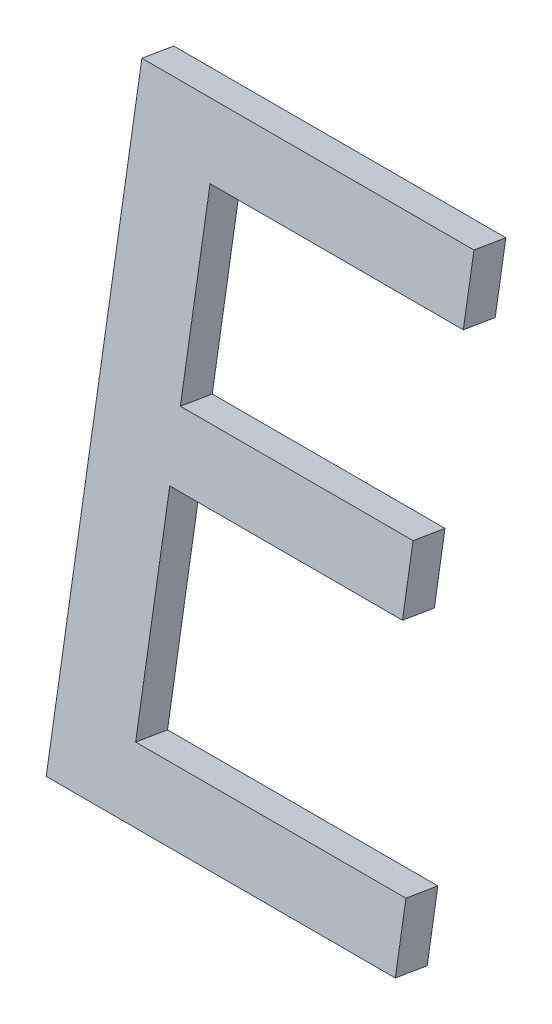
ISO-10303-21;
HEADER;
FILE_DESCRIPTION(('STEP AP214'),'2;1');
FILE_NAME('part.step','',(''),(''),'','','');
FILE_SCHEMA(('AUTOMOTIVE_DESIGN { 1 0 10303 214 1 1 1 1 }'));
ENDSEC;
DATA;
#1=APPLICATION_CONTEXT('core data for automotive mechanical design processes');
#2=APPLICATION_PROTOCOL_DEFINITION('international standard','automotive_design',2000,#1);
#3=PRODUCT_CONTEXT('',#1,'mechanical');
#4=PRODUCT('Part','Part','',(#3));
#5=PRODUCT_RELATED_PRODUCT_CATEGORY('part','',(#4));
#6=PRODUCT_DEFINITION_FORMATION('','',#4);
#7=PRODUCT_DEFINITION_CONTEXT('part definition',#1,'design');
#8=PRODUCT_DEFINITION('design','',#6,#7);
#9=PRODUCT_DEFINITION_SHAPE('','',#8);
#10=(LENGTH_UNIT() NAMED_UNIT(*) SI_UNIT(.MILLI.,.METRE.));
#11=(NAMED_UNIT(*) PLANE_ANGLE_UNIT() SI_UNIT($,.RADIAN.));
#12=(NAMED_UNIT(*) SI_UNIT($,.STERADIAN.) SOLID_ANGLE_UNIT());
#13=UNCERTAINTY_MEASURE_WITH_UNIT(LENGTH_MEASURE(1.E-05),#10,'distance_accuracy_value','');
#14=(GEOMETRIC_REPRESENTATION_CONTEXT(3) GLOBAL_UNCERTAINTY_ASSIGNED_CONTEXT((#13)) GLOBAL_UNIT_ASSIGNED_CONTEXT((#10,
#11,#12)) REPRESENTATION_CONTEXT('',''));
#15=CARTESIAN_POINT('',(0.,0.,0.));
#16=DIRECTION('',(0.,0.,1.));
#17=DIRECTION('',(1.,0.,0.));
#18=AXIS2_PLACEMENT_3D('',#15,#16,#17);
#19=CARTESIAN_POINT('',(1436.6184962406,1188.45228553672,1236.29933367569));
#20=DIRECTION('',(-1.,0.,0.));
#21=DIRECTION('',(0.,-1.,0.));
#22=AXIS2_PLACEMENT_3D('',#19,#20,#21);
#23=PLANE('',#22);
#24=CARTESIAN_POINT('',(1436.6184962406,1187.63029060019,1231.36736405653));
#25=CARTESIAN_POINT('',(1436.6184962406,1217.22210831516,1226.43539443737));
#26=CARTESIAN_POINT('',(1436.6184962406,1246.81392603012,1221.50342481821));
#27=CARTESIAN_POINT('',(1436.6184962406,1276.40574374509,1216.57145519905));
#28=B_SPLINE_CURVE_WITH_KNOTS('',3,(#24,#25,#26,#27),.UNSPECIFIED.,.F.,.F.,(4,4),(0.,
0.205346629227362),.UNSPECIFIED.);
#29=CARTESIAN_POINT('',(1436.6184962406,1187.63029060019,1231.36736405653));
#30=VERTEX_POINT('',#29);
#31=CARTESIAN_POINT('',(1436.6184962406,1276.40574374509,1216.57145519905));
#32=VERTEX_POINT('',#31);
#33=EDGE_CURVE('E117',#30,#32,#28,.T.);
#34=ORIENTED_EDGE('',*,*,#33,.F.);
#35=DIRECTION('',(0.,-0.164398987305355,-0.986393923832144));
#36=VECTOR('',#35,1.);
#37=CARTESIAN_POINT('',(1436.6184962406,1188.45228553672,1236.29933367569));
#38=LINE('',#37,#36);
#39=CARTESIAN_POINT('',(1436.6184962406,1188.45228553672,1236.29933367569));
#40=VERTEX_POINT('',#39);
#41=EDGE_CURVE('E108',#40,#30,#38,.T.);
#42=ORIENTED_EDGE('',*,*,#41,.F.);
#43=CARTESIAN_POINT('',(1436.6184962406,1188.45228553672,1236.29933367569));
#44=CARTESIAN_POINT('',(1436.6184962406,1218.04410325169,1231.36736405653));
#45=CARTESIAN_POINT('',(1436.6184962406,1247.63592096665,1226.43539443737));
#46=CARTESIAN_POINT('',(1436.6184962406,1277.22773868161,1221.50342481821));
#47=B_SPLINE_CURVE_WITH_KNOTS('',3,(#43,#44,#45,#46),.UNSPECIFIED.,.F.,.F.,(4,4),(0.,
0.205346629227362),.UNSPECIFIED.);
#48=CARTESIAN_POINT('',(1436.6184962406,1277.22773868161,1221.50342481821));
#49=VERTEX_POINT('',#48);
#50=EDGE_CURVE('E116',#40,#49,#47,.T.);
#51=ORIENTED_EDGE('',*,*,#50,.T.);
#52=DIRECTION('',(0.,-0.164398987305355,-0.986393923832144));
#53=VECTOR('',#52,1.);
#54=CARTESIAN_POINT('',(1436.6184962406,1277.22773868161,1221.50342481821));
#55=LINE('',#54,#53);
#56=EDGE_CURVE('E126',#49,#32,#55,.T.);
#57=ORIENTED_EDGE('',*,*,#56,.T.);
#58=EDGE_LOOP('',(#34,#42,#51,#57));
#59=FACE_BOUND('',#58,.T.);
#60=ADVANCED_FACE('F17',(#59),#23,.T.);
#61=CARTESIAN_POINT('',(1436.6184962406,1277.22773868161,1221.50342481821));
#62=DIRECTION('',(0.,0.986393923832144,-0.164398987305355));
#63=DIRECTION('',(0.,0.164398987305355,0.986393923832144));
#64=AXIS2_PLACEMENT_3D('',#61,#62,#63);
#65=PLANE('',#64);
#66=CARTESIAN_POINT('',(1436.6184962406,1276.40574374509,1216.57145519905));
#67=CARTESIAN_POINT('',(1453.7354887218,1276.40574374509,1216.57145519905));
#68=CARTESIAN_POINT('',(1470.852481203,1276.40574374509,1216.57145519905));
#69=CARTESIAN_POINT('',(1487.96947368421,1276.40574374509,1216.57145519905));
#70=B_SPLINE_CURVE_WITH_KNOTS('',3,(#66,#67,#68,#69),.UNSPECIFIED.,.F.,.F.,(4,4),
(0.205346629227362,0.322510519511532),.UNSPECIFIED.);
#71=CARTESIAN_POINT('',(1487.96947368421,1276.40574374509,1216.57145519905));
#72=VERTEX_POINT('',#71);
#73=EDGE_CURVE('E144',#32,#72,#70,.T.);
#74=ORIENTED_EDGE('',*,*,#73,.F.);
#75=ORIENTED_EDGE('',*,*,#56,.F.);
#76=CARTESIAN_POINT('',(1436.6184962406,1277.22773868161,1221.50342481821));
#77=CARTESIAN_POINT('',(1453.7354887218,1277.22773868161,1221.50342481821));
#78=CARTESIAN_POINT('',(1470.852481203,1277.22773868161,1221.50342481821));
#79=CARTESIAN_POINT('',(1487.96947368421,1277.22773868161,1221.50342481821));
#80=B_SPLINE_CURVE_WITH_KNOTS('',3,(#76,#77,#78,#79),.UNSPECIFIED.,.F.,.F.,(4,4),
(0.205346629227362,0.322510519511532),.UNSPECIFIED.);
#81=CARTESIAN_POINT('',(1487.96947368421,1277.22773868161,1221.50342481821));
#82=VERTEX_POINT('',#81);
#83=EDGE_CURVE('E154',#49,#82,#80,.T.);
#84=ORIENTED_EDGE('',*,*,#83,.T.);
#85=DIRECTION('',(0.,-0.164398987305355,-0.986393923832144));
#86=VECTOR('',#85,1.);
#87=CARTESIAN_POINT('',(1487.96947368421,1277.22773868161,1221.50342481821));
#88=LINE('',#87,#86);
#89=EDGE_CURVE('E165',#82,#72,#88,.T.);
#90=ORIENTED_EDGE('',*,*,#89,.T.);
#91=EDGE_LOOP('',(#74,#75,#84,#90));
#92=FACE_BOUND('',#91,.T.);
#93=ADVANCED_FACE('F536',(#92),#65,.T.);
#94=CARTESIAN_POINT('',(1487.96947368421,1277.22773868161,1221.50342481821));
#95=DIRECTION('',(1.,0.,0.));
#96=DIRECTION('',(0.,0.,-1.));
#97=AXIS2_PLACEMENT_3D('',#94,#95,#96);
#98=PLANE('',#97);
#99=CARTESIAN_POINT('',(1487.96947368421,1276.40574374509,1216.57145519905));
#100=CARTESIAN_POINT('',(1487.96947368421,1273.11632221878,1217.1196921201));
#101=CARTESIAN_POINT('',(1487.96947368421,1269.82690069247,1217.66792904115));
#102=CARTESIAN_POINT('',(1487.96947368421,1266.53747916617,1218.2161659622));
#103=B_SPLINE_CURVE_WITH_KNOTS('',3,(#99,#100,#101,#102),.UNSPECIFIED.,.F.,.F.,(4,4),
(0.322510519511532,0.345336816599512),.UNSPECIFIED.);
#104=CARTESIAN_POINT('',(1487.96947368421,1266.53747916617,1218.2161659622));
#105=VERTEX_POINT('',#104);
#106=EDGE_CURVE('E168',#72,#105,#103,.T.);
#107=ORIENTED_EDGE('',*,*,#106,.F.);
#108=ORIENTED_EDGE('',*,*,#89,.F.);
#109=CARTESIAN_POINT('',(1487.96947368421,1277.22773868161,1221.50342481821));
#110=CARTESIAN_POINT('',(1487.96947368421,1273.93831715531,1222.05166173926));
#111=CARTESIAN_POINT('',(1487.96947368421,1270.648895629,1222.59989866031));
#112=CARTESIAN_POINT('',(1487.96947368421,1267.35947410269,1223.14813558136));
#113=B_SPLINE_CURVE_WITH_KNOTS('',3,(#109,#110,#111,#112),.UNSPECIFIED.,.F.,.F.,(4,4),
(0.322510519511532,0.345336816599512),.UNSPECIFIED.);
#114=CARTESIAN_POINT('',(1487.96947368421,1267.35947410269,1223.14813558136));
#115=VERTEX_POINT('',#114);
#116=EDGE_CURVE('E179',#82,#115,#113,.T.);
#117=ORIENTED_EDGE('',*,*,#116,.T.);
#118=DIRECTION('',(0.,-0.164398987305355,-0.986393923832144));
#119=VECTOR('',#118,1.);
#120=CARTESIAN_POINT('',(1487.96947368421,1267.35947410269,1223.14813558136));
#121=LINE('',#120,#119);
#122=EDGE_CURVE('E190',#115,#105,#121,.T.);
#123=ORIENTED_EDGE('',*,*,#122,.T.);
#124=EDGE_LOOP('',(#107,#108,#117,#123));
#125=FACE_BOUND('',#124,.T.);
#126=ADVANCED_FACE('F525',(#125),#98,.T.);
#127=CARTESIAN_POINT('',(1487.96947368421,1267.35947410269,1223.14813558136));
#128=DIRECTION('',(0.,-0.986393923832144,0.164398987305355));
#129=DIRECTION('',(0.,-0.164398987305355,-0.986393923832144));
#130=AXIS2_PLACEMENT_3D('',#127,#128,#129);
#131=PLANE('',#130);
#132=CARTESIAN_POINT('',(1487.96947368421,1266.53747916617,1218.2161659622));
#133=CARTESIAN_POINT('',(1474.91503759398,1266.53747916617,1218.2161659622));
#134=CARTESIAN_POINT('',(1461.86060150376,1266.53747916617,1218.2161659622));
#135=CARTESIAN_POINT('',(1448.80616541353,1266.53747916617,1218.2161659622));
#136=B_SPLINE_CURVE_WITH_KNOTS('',3,(#132,#133,#134,#135),.UNSPECIFIED.,.F.,.F.,(4,4),
(0.345336816599512,0.434692964852573),.UNSPECIFIED.);
#137=CARTESIAN_POINT('',(1448.80616541353,1266.53747916617,1218.2161659622));
#138=VERTEX_POINT('',#137);
#139=EDGE_CURVE('E193',#105,#138,#136,.T.);
#140=ORIENTED_EDGE('',*,*,#139,.F.);
#141=ORIENTED_EDGE('',*,*,#122,.F.);
#142=CARTESIAN_POINT('',(1487.96947368421,1267.35947410269,1223.14813558136));
#143=CARTESIAN_POINT('',(1474.91503759398,1267.35947410269,1223.14813558136));
#144=CARTESIAN_POINT('',(1461.86060150376,1267.35947410269,1223.14813558136));
#145=CARTESIAN_POINT('',(1448.80616541353,1267.35947410269,1223.14813558136));
#146=B_SPLINE_CURVE_WITH_KNOTS('',3,(#142,#143,#144,#145),.UNSPECIFIED.,.F.,.F.,(4,4),
(0.345336816599512,0.434692964852573),.UNSPECIFIED.);
#147=CARTESIAN_POINT('',(1448.80616541353,1267.35947410269,1223.14813558136));
#148=VERTEX_POINT('',#147);
#149=EDGE_CURVE('E204',#115,#148,#146,.T.);
#150=ORIENTED_EDGE('',*,*,#149,.T.);
#151=DIRECTION('',(0.,-0.164398987305355,-0.986393923832144));
#152=VECTOR('',#151,1.);
#153=CARTESIAN_POINT('',(1448.80616541353,1267.35947410269,1223.14813558136));
#154=LINE('',#153,#152);
#155=EDGE_CURVE('E215',#148,#138,#154,.T.);
#156=ORIENTED_EDGE('',*,*,#155,.T.);
#157=EDGE_LOOP('',(#140,#141,#150,#156));
#158=FACE_BOUND('',#157,.T.);
#159=ADVANCED_FACE('F514',(#158),#131,.T.);
#160=CARTESIAN_POINT('',(1448.80616541353,1267.35947410269,1223.14813558136));
#161=DIRECTION('',(1.,0.,0.));
#162=DIRECTION('',(0.,0.,-1.));
#163=AXIS2_PLACEMENT_3D('',#160,#161,#162);
#164=PLANE('',#163);
#165=CARTESIAN_POINT('',(1448.80616541353,1266.53747916617,1218.2161659622));
#166=CARTESIAN_POINT('',(1448.80616541353,1257.36343175355,1219.74517386431));
#167=CARTESIAN_POINT('',(1448.80616541353,1248.18938434093,1221.27418176641));
#168=CARTESIAN_POINT('',(1448.80616541353,1239.01533692831,1222.80318966851));
#169=B_SPLINE_CURVE_WITH_KNOTS('',3,(#165,#166,#167,#168),.UNSPECIFIED.,.F.,.F.,(4,4),
(0.434692964852573,0.498354471918455),.UNSPECIFIED.);
#170=CARTESIAN_POINT('',(1448.80616541353,1239.01533692831,1222.80318966851));
#171=VERTEX_POINT('',#170);
#172=EDGE_CURVE('E218',#138,#171,#169,.T.);
#173=ORIENTED_EDGE('',*,*,#172,.F.);
#174=ORIENTED_EDGE('',*,*,#155,.F.);
#175=CARTESIAN_POINT('',(1448.80616541353,1267.35947410269,1223.14813558136));
#176=CARTESIAN_POINT('',(1448.80616541353,1258.18542669007,1224.67714348347));
#177=CARTESIAN_POINT('',(1448.80616541353,1249.01137927745,1226.20615138557));
#178=CARTESIAN_POINT('',(1448.80616541353,1239.83733186483,1227.73515928767));
#179=B_SPLINE_CURVE_WITH_KNOTS('',3,(#175,#176,#177,#178),.UNSPECIFIED.,.F.,.F.,(4,4),
(0.434692964852573,0.498354471918455),.UNSPECIFIED.);
#180=CARTESIAN_POINT('',(1448.80616541353,1239.83733186483,1227.73515928767));
#181=VERTEX_POINT('',#180);
#182=EDGE_CURVE('E229',#148,#181,#179,.T.);
#183=ORIENTED_EDGE('',*,*,#182,.T.);
#184=DIRECTION('',(0.,-0.164398987305355,-0.986393923832144));
#185=VECTOR('',#184,1.);
#186=CARTESIAN_POINT('',(1448.80616541353,1239.83733186483,1227.73515928767));
#187=LINE('',#186,#185);
#188=EDGE_CURVE('E240',#181,#171,#187,.T.);
#189=ORIENTED_EDGE('',*,*,#188,.T.);
#190=EDGE_LOOP('',(#173,#174,#183,#189));
#191=FACE_BOUND('',#190,.T.);
#192=ADVANCED_FACE('F503',(#191),#164,.T.);
#193=CARTESIAN_POINT('',(1448.80616541353,1239.83733186483,1227.73515928767));
#194=DIRECTION('',(0.,0.986393923832144,-0.164398987305355));
#195=DIRECTION('',(0.,0.164398987305355,0.986393923832144));
#196=AXIS2_PLACEMENT_3D('',#193,#194,#195);
#197=PLANE('',#196);
#198=CARTESIAN_POINT('',(1448.80616541353,1239.01533692831,1222.80318966851));
#199=CARTESIAN_POINT('',(1460.80195488722,1239.01533692831,1222.80318966851));
#200=CARTESIAN_POINT('',(1472.7977443609,1239.01533692831,1222.80318966851));
#201=CARTESIAN_POINT('',(1484.79353383458,1239.01533692831,1222.80318966851));
#202=B_SPLINE_CURVE_WITH_KNOTS('',3,(#198,#199,#200,#201),.UNSPECIFIED.,.F.,.F.,(4,4),
(0.498354471918455,0.580464303029859),.UNSPECIFIED.);
#203=CARTESIAN_POINT('',(1484.79353383458,1239.01533692831,1222.80318966851));
#204=VERTEX_POINT('',#203);
#205=EDGE_CURVE('E243',#171,#204,#202,.T.);
#206=ORIENTED_EDGE('',*,*,#205,.F.);
#207=ORIENTED_EDGE('',*,*,#188,.F.);
#208=CARTESIAN_POINT('',(1448.80616541353,1239.83733186483,1227.73515928767));
#209=CARTESIAN_POINT('',(1460.80195488722,1239.83733186483,1227.73515928767));
#210=CARTESIAN_POINT('',(1472.7977443609,1239.83733186483,1227.73515928767));
#211=CARTESIAN_POINT('',(1484.79353383458,1239.83733186483,1227.73515928767));
#212=B_SPLINE_CURVE_WITH_KNOTS('',3,(#208,#209,#210,#211),.UNSPECIFIED.,.F.,.F.,(4,4),
(0.498354471918455,0.580464303029859),.UNSPECIFIED.);
#213=CARTESIAN_POINT('',(1484.79353383458,1239.83733186483,1227.73515928767));
#214=VERTEX_POINT('',#213);
#215=EDGE_CURVE('E254',#181,#214,#212,.T.);
#216=ORIENTED_EDGE('',*,*,#215,.T.);
#217=DIRECTION('',(0.,-0.164398987305355,-0.986393923832144));
#218=VECTOR('',#217,1.);
#219=CARTESIAN_POINT('',(1484.79353383458,1239.83733186483,1227.73515928767));
#220=LINE('',#219,#218);
#221=EDGE_CURVE('E265',#214,#204,#220,.T.);
#222=ORIENTED_EDGE('',*,*,#221,.T.);
#223=EDGE_LOOP('',(#206,#207,#216,#222));
#224=FACE_BOUND('',#223,.T.);
#225=ADVANCED_FACE('F492',(#224),#197,.T.);
#226=CARTESIAN_POINT('',(1484.79353383458,1239.83733186483,1227.73515928767));
#227=DIRECTION('',(1.,0.,0.));
#228=DIRECTION('',(0.,0.,-1.));
#229=AXIS2_PLACEMENT_3D('',#226,#227,#228);
#230=PLANE('',#229);
#231=CARTESIAN_POINT('',(1484.79353383458,1239.01533692831,1222.80318966851));
#232=CARTESIAN_POINT('',(1484.79353383458,1235.7324034129,1223.35034525441));
#233=CARTESIAN_POINT('',(1484.79353383458,1232.44946989749,1223.89750084032));
#234=CARTESIAN_POINT('',(1484.79353383458,1229.16653638208,1224.44465642622));
#235=B_SPLINE_CURVE_WITH_KNOTS('',3,(#231,#232,#233,#234),.UNSPECIFIED.,.F.,.F.,(4,4),
(0.580464303029859,0.603245577835614),.UNSPECIFIED.);
#236=CARTESIAN_POINT('',(1484.79353383458,1229.16653638208,1224.44465642622));
#237=VERTEX_POINT('',#236);
#238=EDGE_CURVE('E268',#204,#237,#235,.T.);
#239=ORIENTED_EDGE('',*,*,#238,.F.);
#240=ORIENTED_EDGE('',*,*,#221,.F.);
#241=CARTESIAN_POINT('',(1484.79353383458,1239.83733186483,1227.73515928767));
#242=CARTESIAN_POINT('',(1484.79353383458,1236.55439834943,1228.28231487358));
#243=CARTESIAN_POINT('',(1484.79353383458,1233.27146483402,1228.82947045948));
#244=CARTESIAN_POINT('',(1484.79353383458,1229.98853131861,1229.37662604538));
#245=B_SPLINE_CURVE_WITH_KNOTS('',3,(#241,#242,#243,#244),.UNSPECIFIED.,.F.,.F.,(4,4),
(0.580464303029859,0.603245577835614),.UNSPECIFIED.);
#246=CARTESIAN_POINT('',(1484.79353383458,1229.98853131861,1229.37662604538));
#247=VERTEX_POINT('',#246);
#248=EDGE_CURVE('E279',#214,#247,#245,.T.);
#249=ORIENTED_EDGE('',*,*,#248,.T.);
#250=DIRECTION('',(0.,-0.164398987305355,-0.986393923832144));
#251=VECTOR('',#250,1.);
#252=CARTESIAN_POINT('',(1484.79353383458,1229.98853131861,1229.37662604538));
#253=LINE('',#252,#251);
#254=EDGE_CURVE('E290',#247,#237,#253,.T.);
#255=ORIENTED_EDGE('',*,*,#254,.T.);
#256=EDGE_LOOP('',(#239,#240,#249,#255));
#257=FACE_BOUND('',#256,.T.);
#258=ADVANCED_FACE('F481',(#257),#230,.T.);
#259=CARTESIAN_POINT('',(1484.79353383458,1229.98853131861,1229.37662604538));
#260=DIRECTION('',(0.,-0.986393923832144,0.164398987305355));
#261=DIRECTION('',(0.,-0.164398987305355,-0.986393923832144));
#262=AXIS2_PLACEMENT_3D('',#259,#260,#261);
#263=PLANE('',#262);
#264=CARTESIAN_POINT('',(1484.79353383458,1229.16653638208,1224.44465642622));
#265=CARTESIAN_POINT('',(1472.7977443609,1229.16653638208,1224.44465642622));
#266=CARTESIAN_POINT('',(1460.80195488722,1229.16653638208,1224.44465642622));
#267=CARTESIAN_POINT('',(1448.80616541353,1229.16653638209,1224.44465642622));
#268=B_SPLINE_CURVE_WITH_KNOTS('',3,(#264,#265,#266,#267),.UNSPECIFIED.,.F.,.F.,(4,4),
(0.603245577835614,0.685355408947018),.UNSPECIFIED.);
#269=CARTESIAN_POINT('',(1448.80616541353,1229.16653638209,1224.44465642622));
#270=VERTEX_POINT('',#269);
#271=EDGE_CURVE('E293',#237,#270,#268,.T.);
#272=ORIENTED_EDGE('',*,*,#271,.F.);
#273=ORIENTED_EDGE('',*,*,#254,.F.);
#274=CARTESIAN_POINT('',(1484.79353383458,1229.98853131861,1229.37662604538));
#275=CARTESIAN_POINT('',(1472.7977443609,1229.98853131861,1229.37662604538));
#276=CARTESIAN_POINT('',(1460.80195488722,1229.98853131861,1229.37662604538));
#277=CARTESIAN_POINT('',(1448.80616541353,1229.98853131861,1229.37662604538));
#278=B_SPLINE_CURVE_WITH_KNOTS('',3,(#274,#275,#276,#277),.UNSPECIFIED.,.F.,.F.,(4,4),
(0.603245577835614,0.685355408947018),.UNSPECIFIED.);
#279=CARTESIAN_POINT('',(1448.80616541353,1229.98853131861,1229.37662604538));
#280=VERTEX_POINT('',#279);
#281=EDGE_CURVE('E304',#247,#280,#278,.T.);
#282=ORIENTED_EDGE('',*,*,#281,.T.);
#283=DIRECTION('',(0.,-0.164398987305355,-0.986393923832144));
#284=VECTOR('',#283,1.);
#285=CARTESIAN_POINT('',(1448.80616541353,1229.98853131861,1229.37662604538));
#286=LINE('',#285,#284);
#287=EDGE_CURVE('E315',#280,#270,#286,.T.);
#288=ORIENTED_EDGE('',*,*,#287,.T.);
#289=EDGE_LOOP('',(#272,#273,#282,#288));
#290=FACE_BOUND('',#289,.T.);
#291=ADVANCED_FACE('F470',(#290),#263,.T.);
#292=CARTESIAN_POINT('',(1448.80616541353,1229.98853131861,1229.37662604538));
#293=DIRECTION('',(1.,0.,0.));
#294=DIRECTION('',(0.,0.,-1.));
#295=AXIS2_PLACEMENT_3D('',#292,#293,#294);
#296=PLANE('',#295);
#297=CARTESIAN_POINT('',(1448.80616541353,1229.16653638209,1224.44465642622));
#298=CARTESIAN_POINT('',(1448.80616541353,1218.61054264776,1226.20398871527));
#299=CARTESIAN_POINT('',(1448.80616541353,1208.05454891344,1227.96332100432));
#300=CARTESIAN_POINT('',(1448.80616541353,1197.49855517912,1229.72265329338));
#301=B_SPLINE_CURVE_WITH_KNOTS('',3,(#297,#298,#299,#300),.UNSPECIFIED.,.F.,.F.,(4,4),
(0.685355408947018,0.758606662126785),.UNSPECIFIED.);
#302=CARTESIAN_POINT('',(1448.80616541353,1197.49855517912,1229.72265329338));
#303=VERTEX_POINT('',#302);
#304=EDGE_CURVE('E318',#270,#303,#301,.T.);
#305=ORIENTED_EDGE('',*,*,#304,.F.);
#306=ORIENTED_EDGE('',*,*,#287,.F.);
#307=CARTESIAN_POINT('',(1448.80616541353,1229.98853131861,1229.37662604538));
#308=CARTESIAN_POINT('',(1448.80616541353,1219.43253758429,1231.13595833443));
#309=CARTESIAN_POINT('',(1448.80616541353,1208.87654384997,1232.89529062349));
#310=CARTESIAN_POINT('',(1448.80616541353,1198.32055011564,1234.65462291254));
#311=B_SPLINE_CURVE_WITH_KNOTS('',3,(#307,#308,#309,#310),.UNSPECIFIED.,.F.,.F.,(4,4),
(0.685355408947018,0.758606662126785),.UNSPECIFIED.);
#312=CARTESIAN_POINT('',(1448.80616541353,1198.32055011564,1234.65462291254));
#313=VERTEX_POINT('',#312);
#314=EDGE_CURVE('E329',#280,#313,#311,.T.);
#315=ORIENTED_EDGE('',*,*,#314,.T.);
#316=DIRECTION('',(0.,-0.164398987305355,-0.986393923832144));
#317=VECTOR('',#316,1.);
#318=CARTESIAN_POINT('',(1448.80616541353,1198.32055011564,1234.65462291254));
#319=LINE('',#318,#317);
#320=EDGE_CURVE('E340',#313,#303,#319,.T.);
#321=ORIENTED_EDGE('',*,*,#320,.T.);
#322=EDGE_LOOP('',(#305,#306,#315,#321));
#323=FACE_BOUND('',#322,.T.);
#324=ADVANCED_FACE('F459',(#323),#296,.T.);
#325=CARTESIAN_POINT('',(1448.80616541353,1198.32055011564,1234.65462291254));
#326=DIRECTION('',(0.,0.986393923832144,-0.164398987305355));
#327=DIRECTION('',(0.,0.164398987305355,0.986393923832144));
#328=AXIS2_PLACEMENT_3D('',#325,#326,#327);
#329=PLANE('',#328);
#330=CARTESIAN_POINT('',(1448.80616541353,1197.49855517912,1229.72265329338));
#331=CARTESIAN_POINT('',(1462.74060150376,1197.49855517912,1229.72265329338));
#332=CARTESIAN_POINT('',(1476.67503759398,1197.49855517912,1229.72265329338));
#333=CARTESIAN_POINT('',(1490.60947368421,1197.49855517912,1229.72265329338));
#334=B_SPLINE_CURVE_WITH_KNOTS('',3,(#330,#331,#332,#333),.UNSPECIFIED.,.F.,.F.,(4,4),
(0.758606662126785,0.853986311503848),.UNSPECIFIED.);
#335=CARTESIAN_POINT('',(1490.60947368421,1197.49855517912,1229.72265329338));
#336=VERTEX_POINT('',#335);
#337=EDGE_CURVE('E343',#303,#336,#334,.T.);
#338=ORIENTED_EDGE('',*,*,#337,.F.);
#339=ORIENTED_EDGE('',*,*,#320,.F.);
#340=CARTESIAN_POINT('',(1448.80616541353,1198.32055011564,1234.65462291254));
#341=CARTESIAN_POINT('',(1462.74060150376,1198.32055011564,1234.65462291254));
#342=CARTESIAN_POINT('',(1476.67503759398,1198.32055011564,1234.65462291254));
#343=CARTESIAN_POINT('',(1490.60947368421,1198.32055011564,1234.65462291254));
#344=B_SPLINE_CURVE_WITH_KNOTS('',3,(#340,#341,#342,#343),.UNSPECIFIED.,.F.,.F.,(4,4),
(0.758606662126785,0.853986311503848),.UNSPECIFIED.);
#345=CARTESIAN_POINT('',(1490.60947368421,1198.32055011564,1234.65462291254));
#346=VERTEX_POINT('',#345);
#347=EDGE_CURVE('E353',#313,#346,#344,.T.);
#348=ORIENTED_EDGE('',*,*,#347,.T.);
#349=DIRECTION('',(0.,-0.164398987305355,-0.986393923832144));
#350=VECTOR('',#349,1.);
#351=CARTESIAN_POINT('',(1490.60947368421,1198.32055011564,1234.65462291254));
#352=LINE('',#351,#350);
#353=EDGE_CURVE('E364',#346,#336,#352,.T.);
#354=ORIENTED_EDGE('',*,*,#353,.T.);
#355=EDGE_LOOP('',(#338,#339,#348,#354));
#356=FACE_BOUND('',#355,.T.);
#357=ADVANCED_FACE('F449',(#356),#329,.T.);
#358=CARTESIAN_POINT('',(1490.60947368421,1198.32055011564,1234.65462291254));
#359=DIRECTION('',(1.,0.,0.));
#360=DIRECTION('',(0.,0.,-1.));
#361=AXIS2_PLACEMENT_3D('',#358,#359,#360);
#362=PLANE('',#361);
#363=CARTESIAN_POINT('',(1490.60947368421,1197.49855517912,1229.72265329338));
#364=CARTESIAN_POINT('',(1490.60947368421,1194.20913365281,1230.27089021443));
#365=CARTESIAN_POINT('',(1490.60947368421,1190.9197121265,1230.81912713548));
#366=CARTESIAN_POINT('',(1490.60947368421,1187.63029060019,1231.36736405653));
#367=B_SPLINE_CURVE_WITH_KNOTS('',3,(#363,#364,#365,#366),.UNSPECIFIED.,.F.,.F.,(4,4),
(0.853986311503848,0.876812608591827),.UNSPECIFIED.);
#368=CARTESIAN_POINT('',(1490.60947368421,1187.63029060019,1231.36736405653));
#369=VERTEX_POINT('',#368);
#370=EDGE_CURVE('E123',#336,#369,#367,.T.);
#371=ORIENTED_EDGE('',*,*,#370,.F.);
#372=ORIENTED_EDGE('',*,*,#353,.F.);
#373=CARTESIAN_POINT('',(1490.60947368421,1198.32055011564,1234.65462291254));
#374=CARTESIAN_POINT('',(1490.60947368421,1195.03112858934,1235.20285983359));
#375=CARTESIAN_POINT('',(1490.60947368421,1191.74170706303,1235.75109675464));
#376=CARTESIAN_POINT('',(1490.60947368421,1188.45228553672,1236.29933367569));
#377=B_SPLINE_CURVE_WITH_KNOTS('',3,(#373,#374,#375,#376),.UNSPECIFIED.,.F.,.F.,(4,4),
(0.853986311503848,0.876812608591827),.UNSPECIFIED.);
#378=CARTESIAN_POINT('',(1490.60947368421,1188.45228553672,1236.29933367569));
#379=VERTEX_POINT('',#378);
#380=EDGE_CURVE('E376',#346,#379,#377,.T.);
#381=ORIENTED_EDGE('',*,*,#380,.T.);
#382=DIRECTION('',(0.,-0.164398987305355,-0.986393923832144));
#383=VECTOR('',#382,1.);
#384=CARTESIAN_POINT('',(1490.60947368421,1188.45228553672,1236.29933367569));
#385=LINE('',#384,#383);
#386=EDGE_CURVE('E39',#379,#369,#385,.T.);
#387=ORIENTED_EDGE('',*,*,#386,.T.);
#388=EDGE_LOOP('',(#371,#372,#381,#387));
#389=FACE_BOUND('',#388,.T.);
#390=ADVANCED_FACE('F410',(#389),#362,.T.);
#391=CARTESIAN_POINT('',(1490.60947368421,1188.45228553672,1236.29933367569));
#392=DIRECTION('',(0.,-0.986393923832144,0.164398987305355));
#393=DIRECTION('',(0.,-0.164398987305355,-0.986393923832144));
#394=AXIS2_PLACEMENT_3D('',#391,#392,#393);
#395=PLANE('',#394);
#396=CARTESIAN_POINT('',(1490.60947368421,1187.63029060019,1231.36736405653));
#397=CARTESIAN_POINT('',(1472.612481203,1187.63029060019,1231.36736405653));
#398=CARTESIAN_POINT('',(1454.6154887218,1187.63029060019,1231.36736405653));
#399=CARTESIAN_POINT('',(1436.6184962406,1187.63029060019,1231.36736405653));
#400=B_SPLINE_CURVE_WITH_KNOTS('',3,(#396,#397,#398,#399),.UNSPECIFIED.,.F.,.F.,(4,4),
(0.876812608591827,1.),.UNSPECIFIED.);
#401=EDGE_CURVE('E30',#369,#30,#400,.T.);
#402=ORIENTED_EDGE('',*,*,#401,.F.);
#403=ORIENTED_EDGE('',*,*,#386,.F.);
#404=CARTESIAN_POINT('',(1490.60947368421,1188.45228553672,1236.29933367569));
#405=CARTESIAN_POINT('',(1472.612481203,1188.45228553672,1236.29933367569));
#406=CARTESIAN_POINT('',(1454.6154887218,1188.45228553672,1236.29933367569));
#407=CARTESIAN_POINT('',(1436.6184962406,1188.45228553672,1236.29933367569));
#408=B_SPLINE_CURVE_WITH_KNOTS('',3,(#404,#405,#406,#407),.UNSPECIFIED.,.F.,.F.,(4,4),
(0.876812608591827,1.),.UNSPECIFIED.);
#409=EDGE_CURVE('E11',#379,#40,#408,.T.);
#410=ORIENTED_EDGE('',*,*,#409,.T.);
#411=ORIENTED_EDGE('',*,*,#41,.T.);
#412=EDGE_LOOP('',(#402,#403,#410,#411));
#413=FACE_BOUND('',#412,.T.);
#414=ADVANCED_FACE('F111',(#413),#395,.T.);
#415=CARTESIAN_POINT('',(1436.6184962406,1232.84001210917,1228.90137924695));
#416=DIRECTION('',(0.,0.16439898730535,0.986393923832145));
#417=DIRECTION('',(0.,-0.986393923832145,0.16439898730535));
#418=AXIS2_PLACEMENT_3D('',#415,#416,#417);
#419=PLANE('',#418);
#420=ORIENTED_EDGE('',*,*,#50,.F.);
#421=ORIENTED_EDGE('',*,*,#409,.F.);
#422=ORIENTED_EDGE('',*,*,#380,.F.);
#423=ORIENTED_EDGE('',*,*,#347,.F.);
#424=ORIENTED_EDGE('',*,*,#314,.F.);
#425=ORIENTED_EDGE('',*,*,#281,.F.);
#426=ORIENTED_EDGE('',*,*,#248,.F.);
#427=ORIENTED_EDGE('',*,*,#215,.F.);
#428=ORIENTED_EDGE('',*,*,#182,.F.);
#429=ORIENTED_EDGE('',*,*,#149,.F.);
#430=ORIENTED_EDGE('',*,*,#116,.F.);
#431=ORIENTED_EDGE('',*,*,#83,.F.);
#432=EDGE_LOOP('',(#420,#421,#422,#423,#424,#425,#426,#427,#428,#429,#430,#431));
#433=FACE_BOUND('',#432,.T.);
#434=ADVANCED_FACE('F409',(#433),#419,.T.);
#435=CARTESIAN_POINT('',(1436.6184962406,1232.01801717264,1223.96940962779));
#436=DIRECTION('',(0.,0.16439898730535,0.986393923832145));
#437=DIRECTION('',(0.,-0.986393923832145,0.16439898730535));
#438=AXIS2_PLACEMENT_3D('',#435,#436,#437);
#439=PLANE('',#438);
#440=ORIENTED_EDGE('',*,*,#33,.T.);
#441=ORIENTED_EDGE('',*,*,#73,.T.);
#442=ORIENTED_EDGE('',*,*,#106,.T.);
#443=ORIENTED_EDGE('',*,*,#139,.T.);
#444=ORIENTED_EDGE('',*,*,#172,.T.);
#445=ORIENTED_EDGE('',*,*,#205,.T.);
#446=ORIENTED_EDGE('',*,*,#238,.T.);
#447=ORIENTED_EDGE('',*,*,#271,.T.);
#448=ORIENTED_EDGE('',*,*,#304,.T.);
#449=ORIENTED_EDGE('',*,*,#337,.T.);
#450=ORIENTED_EDGE('',*,*,#370,.T.);
#451=ORIENTED_EDGE('',*,*,#401,.T.);
#452=EDGE_LOOP('',(#440,#441,#442,#443,#444,#445,#446,#447,#448,#449,#450,#451));
#453=FACE_BOUND('',#452,.T.);
#454=ADVANCED_FACE('F19',(#453),#439,.F.);
#455=CLOSED_SHELL('',(#60,#93,#126,#159,#192,#225,#258,#291,#324,#357,#390,#414,#434,#454));
#456=MANIFOLD_SOLID_BREP('B1',#455);
#457=ADVANCED_BREP_SHAPE_REPRESENTATION('',(#18,#456),#14);
#458=SHAPE_DEFINITION_REPRESENTATION(#9,#457);
ENDSEC;
END-ISO-10303-21;
